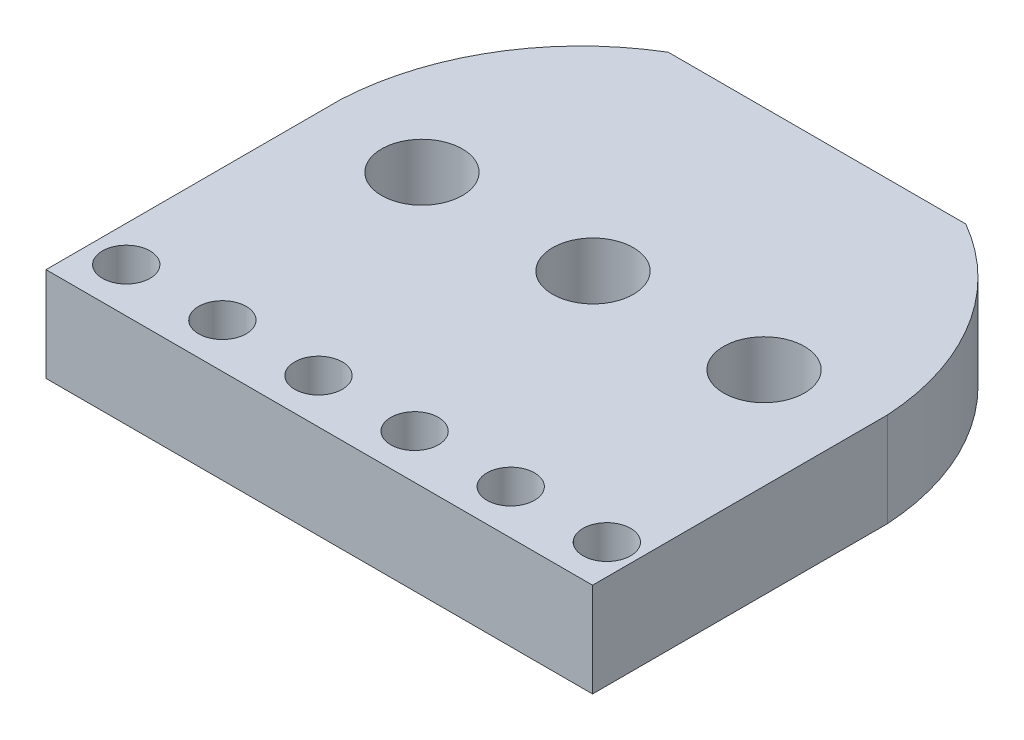
ISO-10303-21;
HEADER;
FILE_DESCRIPTION(('STEP AP214'),'2;1');
FILE_NAME('part.step','',(''),(''),'','','');
FILE_SCHEMA(('AUTOMOTIVE_DESIGN { 1 0 10303 214 1 1 1 1 }'));
ENDSEC;
DATA;
#1=APPLICATION_CONTEXT('core data for automotive mechanical design processes');
#2=APPLICATION_PROTOCOL_DEFINITION('international standard','automotive_design',2000,#1);
#3=PRODUCT_CONTEXT('',#1,'mechanical');
#4=PRODUCT('Part','Part','',(#3));
#5=PRODUCT_RELATED_PRODUCT_CATEGORY('part','',(#4));
#6=PRODUCT_DEFINITION_FORMATION('','',#4);
#7=PRODUCT_DEFINITION_CONTEXT('part definition',#1,'design');
#8=PRODUCT_DEFINITION('design','',#6,#7);
#9=PRODUCT_DEFINITION_SHAPE('','',#8);
#10=(LENGTH_UNIT() NAMED_UNIT(*) SI_UNIT(.MILLI.,.METRE.));
#11=(NAMED_UNIT(*) PLANE_ANGLE_UNIT() SI_UNIT($,.RADIAN.));
#12=(NAMED_UNIT(*) SI_UNIT($,.STERADIAN.) SOLID_ANGLE_UNIT());
#13=UNCERTAINTY_MEASURE_WITH_UNIT(LENGTH_MEASURE(1.E-05),#10,'distance_accuracy_value','');
#14=(GEOMETRIC_REPRESENTATION_CONTEXT(3) GLOBAL_UNCERTAINTY_ASSIGNED_CONTEXT((#13)) GLOBAL_UNIT_ASSIGNED_CONTEXT((#10,
#11,#12)) REPRESENTATION_CONTEXT('',''));
#15=CARTESIAN_POINT('',(0.,0.,0.));
#16=DIRECTION('',(0.,0.,1.));
#17=DIRECTION('',(1.,0.,0.));
#18=AXIS2_PLACEMENT_3D('',#15,#16,#17);
#19=CARTESIAN_POINT('',(5.8,2.,5.3));
#20=DIRECTION('',(-1.,0.,0.));
#21=DIRECTION('',(0.,0.,1.));
#22=AXIS2_PLACEMENT_3D('',#19,#20,#21);
#23=PLANE('',#22);
#24=DIRECTION('',(0.,0.,-1.));
#25=VECTOR('',#24,1.);
#26=CARTESIAN_POINT('',(5.8,0.,5.3));
#27=LINE('',#26,#25);
#28=CARTESIAN_POINT('',(5.8,0.,5.3));
#29=VERTEX_POINT('',#28);
#30=CARTESIAN_POINT('',(5.8,0.,-0.960120866304909));
#31=VERTEX_POINT('',#30);
#32=EDGE_CURVE('E104',#29,#31,#27,.T.);
#33=ORIENTED_EDGE('',*,*,#32,.T.);
#34=DIRECTION('',(0.,1.,0.));
#35=VECTOR('',#34,1.);
#36=CARTESIAN_POINT('',(5.8,0.,-0.960120866304909));
#37=LINE('',#36,#35);
#38=CARTESIAN_POINT('',(5.8,2.,-0.960120866304909));
#39=VERTEX_POINT('',#38);
#40=EDGE_CURVE('E48',#31,#39,#37,.T.);
#41=ORIENTED_EDGE('',*,*,#40,.T.);
#42=DIRECTION('',(0.,0.,-1.));
#43=VECTOR('',#42,1.);
#44=CARTESIAN_POINT('',(5.8,2.,5.3));
#45=LINE('',#44,#43);
#46=CARTESIAN_POINT('',(5.8,2.,5.3));
#47=VERTEX_POINT('',#46);
#48=EDGE_CURVE('E112',#47,#39,#45,.T.);
#49=ORIENTED_EDGE('',*,*,#48,.F.);
#50=DIRECTION('',(0.,-1.,0.));
#51=VECTOR('',#50,1.);
#52=CARTESIAN_POINT('',(5.8,2.,5.3));
#53=LINE('',#52,#51);
#54=EDGE_CURVE('E41',#47,#29,#53,.T.);
#55=ORIENTED_EDGE('',*,*,#54,.T.);
#56=EDGE_LOOP('',(#33,#41,#49,#55));
#57=FACE_BOUND('',#56,.T.);
#58=ADVANCED_FACE('F34',(#57),#23,.F.);
#59=CARTESIAN_POINT('',(-5.8,2.,-5.3));
#60=DIRECTION('',(0.,0.,1.));
#61=DIRECTION('',(1.,0.,0.));
#62=AXIS2_PLACEMENT_3D('',#59,#60,#61);
#63=PLANE('',#62);
#64=DIRECTION('',(-1.,0.,0.));
#65=VECTOR('',#64,1.);
#66=CARTESIAN_POINT('',(-5.8,2.,-5.3));
#67=LINE('',#66,#65);
#68=CARTESIAN_POINT('',(3.12039281549093,2.,-5.3));
#69=VERTEX_POINT('',#68);
#70=CARTESIAN_POINT('',(-3.19151287966167,2.,-5.3));
#71=VERTEX_POINT('',#70);
#72=EDGE_CURVE('E96',#69,#71,#67,.T.);
#73=ORIENTED_EDGE('',*,*,#72,.F.);
#74=DIRECTION('',(0.,1.,0.));
#75=VECTOR('',#74,1.);
#76=CARTESIAN_POINT('',(3.12039281549093,0.,-5.3));
#77=LINE('',#76,#75);
#78=CARTESIAN_POINT('',(3.12039281549093,0.,-5.3));
#79=VERTEX_POINT('',#78);
#80=EDGE_CURVE('E87',#79,#69,#77,.T.);
#81=ORIENTED_EDGE('',*,*,#80,.F.);
#82=DIRECTION('',(-1.,0.,0.));
#83=VECTOR('',#82,1.);
#84=CARTESIAN_POINT('',(-5.8,0.,-5.3));
#85=LINE('',#84,#83);
#86=CARTESIAN_POINT('',(-3.19151287966167,0.,-5.3));
#87=VERTEX_POINT('',#86);
#88=EDGE_CURVE('E56',#79,#87,#85,.T.);
#89=ORIENTED_EDGE('',*,*,#88,.T.);
#90=DIRECTION('',(0.,1.,0.));
#91=VECTOR('',#90,1.);
#92=CARTESIAN_POINT('',(-3.19151287966167,0.,-5.3));
#93=LINE('',#92,#91);
#94=EDGE_CURVE('E126',#87,#71,#93,.T.);
#95=ORIENTED_EDGE('',*,*,#94,.T.);
#96=EDGE_LOOP('',(#73,#81,#89,#95));
#97=FACE_BOUND('',#96,.T.);
#98=ADVANCED_FACE('F95',(#97),#63,.F.);
#99=CARTESIAN_POINT('',(-5.8,2.,5.3));
#100=DIRECTION('',(1.,0.,0.));
#101=DIRECTION('',(0.,0.,-1.));
#102=AXIS2_PLACEMENT_3D('',#99,#100,#101);
#103=PLANE('',#102);
#104=DIRECTION('',(0.,0.,1.));
#105=VECTOR('',#104,1.);
#106=CARTESIAN_POINT('',(-5.8,2.,5.3));
#107=LINE('',#106,#105);
#108=CARTESIAN_POINT('',(-5.8,2.,-0.960120866304909));
#109=VERTEX_POINT('',#108);
#110=CARTESIAN_POINT('',(-5.8,2.,5.3));
#111=VERTEX_POINT('',#110);
#112=EDGE_CURVE('E118',#109,#111,#107,.T.);
#113=ORIENTED_EDGE('',*,*,#112,.F.);
#114=DIRECTION('',(0.,1.,0.));
#115=VECTOR('',#114,1.);
#116=CARTESIAN_POINT('',(-5.8,0.,-0.960120866304909));
#117=LINE('',#116,#115);
#118=CARTESIAN_POINT('',(-5.8,0.,-0.960120866304909));
#119=VERTEX_POINT('',#118);
#120=EDGE_CURVE('E108',#119,#109,#117,.T.);
#121=ORIENTED_EDGE('',*,*,#120,.F.);
#122=DIRECTION('',(0.,0.,1.));
#123=VECTOR('',#122,1.);
#124=CARTESIAN_POINT('',(-5.8,0.,5.3));
#125=LINE('',#124,#123);
#126=CARTESIAN_POINT('',(-5.8,0.,5.3));
#127=VERTEX_POINT('',#126);
#128=EDGE_CURVE('E103',#119,#127,#125,.T.);
#129=ORIENTED_EDGE('',*,*,#128,.T.);
#130=DIRECTION('',(0.,-1.,0.));
#131=VECTOR('',#130,1.);
#132=CARTESIAN_POINT('',(-5.8,2.,5.3));
#133=LINE('',#132,#131);
#134=EDGE_CURVE('E11',#111,#127,#133,.T.);
#135=ORIENTED_EDGE('',*,*,#134,.F.);
#136=EDGE_LOOP('',(#113,#121,#129,#135));
#137=FACE_BOUND('',#136,.T.);
#138=ADVANCED_FACE('F223',(#137),#103,.F.);
#139=CARTESIAN_POINT('',(-5.8,2.,5.3));
#140=DIRECTION('',(0.,0.,-1.));
#141=DIRECTION('',(-1.,0.,0.));
#142=AXIS2_PLACEMENT_3D('',#139,#140,#141);
#143=PLANE('',#142);
#144=DIRECTION('',(1.,0.,0.));
#145=VECTOR('',#144,1.);
#146=CARTESIAN_POINT('',(-5.8,0.,5.3));
#147=LINE('',#146,#145);
#148=EDGE_CURVE('E106',#127,#29,#147,.T.);
#149=ORIENTED_EDGE('',*,*,#148,.T.);
#150=ORIENTED_EDGE('',*,*,#54,.F.);
#151=DIRECTION('',(1.,0.,0.));
#152=VECTOR('',#151,1.);
#153=CARTESIAN_POINT('',(-5.8,2.,5.3));
#154=LINE('',#153,#152);
#155=EDGE_CURVE('E114',#111,#47,#154,.T.);
#156=ORIENTED_EDGE('',*,*,#155,.F.);
#157=ORIENTED_EDGE('',*,*,#134,.T.);
#158=EDGE_LOOP('',(#149,#150,#156,#157));
#159=FACE_BOUND('',#158,.T.);
#160=ADVANCED_FACE('F201',(#159),#143,.F.);
#161=CARTESIAN_POINT('',(0.,2.,0.));
#162=DIRECTION('',(0.,-1.,0.));
#163=DIRECTION('',(0.,0.,-1.));
#164=AXIS2_PLACEMENT_3D('',#161,#162,#163);
#165=PLANE('',#164);
#166=CARTESIAN_POINT('',(5.15936545189926,2.,4.35610393045742));
#167=DIRECTION('',(0.,1.,0.));
#168=DIRECTION('',(0.,0.,1.));
#169=AXIS2_PLACEMENT_3D('',#166,#167,#168);
#170=CIRCLE('',#169,0.505403015569049);
#171=CARTESIAN_POINT('',(5.15936545189926,2.,4.86150694602647));
#172=VERTEX_POINT('',#171);
#173=EDGE_CURVE('E183',#172,#172,#170,.T.);
#174=ORIENTED_EDGE('',*,*,#173,.F.);
#175=EDGE_LOOP('',(#174));
#176=FACE_BOUND('',#175,.T.);
#177=CARTESIAN_POINT('',(3.11936545189926,2.,4.35610393045742));
#178=DIRECTION('',(0.,1.,0.));
#179=DIRECTION('',(0.,0.,1.));
#180=AXIS2_PLACEMENT_3D('',#177,#178,#179);
#181=CIRCLE('',#180,0.505403015569049);
#182=CARTESIAN_POINT('',(3.11936545189926,2.,4.86150694602647));
#183=VERTEX_POINT('',#182);
#184=EDGE_CURVE('E177',#183,#183,#181,.T.);
#185=ORIENTED_EDGE('',*,*,#184,.F.);
#186=EDGE_LOOP('',(#185));
#187=FACE_BOUND('',#186,.T.);
#188=CARTESIAN_POINT('',(1.07936545189926,2.,4.35610393045742));
#189=DIRECTION('',(0.,1.,0.));
#190=DIRECTION('',(0.,0.,1.));
#191=AXIS2_PLACEMENT_3D('',#188,#189,#190);
#192=CIRCLE('',#191,0.505403015569049);
#193=CARTESIAN_POINT('',(1.07936545189926,2.,4.86150694602647));
#194=VERTEX_POINT('',#193);
#195=EDGE_CURVE('E171',#194,#194,#192,.T.);
#196=ORIENTED_EDGE('',*,*,#195,.F.);
#197=EDGE_LOOP('',(#196));
#198=FACE_BOUND('',#197,.T.);
#199=CARTESIAN_POINT('',(-0.960634548100744,2.,4.35610393045742));
#200=DIRECTION('',(0.,1.,0.));
#201=DIRECTION('',(0.,0.,1.));
#202=AXIS2_PLACEMENT_3D('',#199,#200,#201);
#203=CIRCLE('',#202,0.505403015569049);
#204=CARTESIAN_POINT('',(-0.960634548100744,2.,4.86150694602647));
#205=VERTEX_POINT('',#204);
#206=EDGE_CURVE('E165',#205,#205,#203,.T.);
#207=ORIENTED_EDGE('',*,*,#206,.F.);
#208=EDGE_LOOP('',(#207));
#209=FACE_BOUND('',#208,.T.);
#210=CARTESIAN_POINT('',(-3.00063454810074,2.,4.35610393045742));
#211=DIRECTION('',(0.,1.,0.));
#212=DIRECTION('',(0.,0.,1.));
#213=AXIS2_PLACEMENT_3D('',#210,#211,#212);
#214=CIRCLE('',#213,0.505403015569049);
#215=CARTESIAN_POINT('',(-3.00063454810074,2.,4.86150694602647));
#216=VERTEX_POINT('',#215);
#217=EDGE_CURVE('E159',#216,#216,#214,.T.);
#218=ORIENTED_EDGE('',*,*,#217,.F.);
#219=EDGE_LOOP('',(#218));
#220=FACE_BOUND('',#219,.T.);
#221=CARTESIAN_POINT('',(-5.04063454810074,2.,4.35610393045742));
#222=DIRECTION('',(0.,1.,0.));
#223=DIRECTION('',(0.,0.,1.));
#224=AXIS2_PLACEMENT_3D('',#221,#222,#223);
#225=CIRCLE('',#224,0.505403015569049);
#226=CARTESIAN_POINT('',(-5.04063454810074,2.,4.86150694602647));
#227=VERTEX_POINT('',#226);
#228=EDGE_CURVE('E153',#227,#227,#225,.T.);
#229=ORIENTED_EDGE('',*,*,#228,.F.);
#230=EDGE_LOOP('',(#229));
#231=FACE_BOUND('',#230,.T.);
#232=CARTESIAN_POINT('',(3.65954675135661,2.,-0.480060433152458));
#233=DIRECTION('',(0.,1.,0.));
#234=DIRECTION('',(0.,0.,1.));
#235=AXIS2_PLACEMENT_3D('',#232,#233,#234);
#236=CIRCLE('',#235,0.858058489989727);
#237=CARTESIAN_POINT('',(3.65954675135661,2.,0.37799805683727));
#238=VERTEX_POINT('',#237);
#239=EDGE_CURVE('E147',#238,#238,#236,.T.);
#240=ORIENTED_EDGE('',*,*,#239,.F.);
#241=EDGE_LOOP('',(#240));
#242=FACE_BOUND('',#241,.T.);
#243=CARTESIAN_POINT('',(0.0295467513566111,2.,-0.480060433152458));
#244=DIRECTION('',(0.,1.,0.));
#245=DIRECTION('',(0.,0.,1.));
#246=AXIS2_PLACEMENT_3D('',#243,#244,#245);
#247=CIRCLE('',#246,0.858058489989727);
#248=CARTESIAN_POINT('',(0.0295467513566111,2.,0.37799805683727));
#249=VERTEX_POINT('',#248);
#250=EDGE_CURVE('E141',#249,#249,#247,.T.);
#251=ORIENTED_EDGE('',*,*,#250,.F.);
#252=EDGE_LOOP('',(#251));
#253=FACE_BOUND('',#252,.T.);
#254=CARTESIAN_POINT('',(-3.60045324864339,2.,-0.480060433152458));
#255=DIRECTION('',(0.,1.,0.));
#256=DIRECTION('',(0.,0.,1.));
#257=AXIS2_PLACEMENT_3D('',#254,#255,#256);
#258=CIRCLE('',#257,0.858058489989727);
#259=CARTESIAN_POINT('',(-3.60045324864339,2.,0.37799805683727));
#260=VERTEX_POINT('',#259);
#261=EDGE_CURVE('E135',#260,#260,#258,.T.);
#262=ORIENTED_EDGE('',*,*,#261,.F.);
#263=EDGE_LOOP('',(#262));
#264=FACE_BOUND('',#263,.T.);
#265=ORIENTED_EDGE('',*,*,#48,.T.);
#266=CARTESIAN_POINT('',(0.439500257204962,2.,-0.647529016996838));
#267=DIRECTION('',(0.,-1.,0.));
#268=DIRECTION('',(0.,0.,-1.));
#269=AXIS2_PLACEMENT_3D('',#266,#267,#268);
#270=CIRCLE('',#269,5.36960623852061);
#271=EDGE_CURVE('E92',#69,#39,#270,.T.);
#272=ORIENTED_EDGE('',*,*,#271,.F.);
#273=ORIENTED_EDGE('',*,*,#72,.T.);
#274=CARTESIAN_POINT('',(-0.437160224322583,2.,-0.690638590131382));
#275=DIRECTION('',(0.,-1.,0.));
#276=DIRECTION('',(0.,0.,-1.));
#277=AXIS2_PLACEMENT_3D('',#274,#275,#276);
#278=CIRCLE('',#277,5.36960623852061);
#279=EDGE_CURVE('E97',#109,#71,#278,.T.);
#280=ORIENTED_EDGE('',*,*,#279,.F.);
#281=ORIENTED_EDGE('',*,*,#112,.T.);
#282=ORIENTED_EDGE('',*,*,#155,.T.);
#283=EDGE_LOOP('',(#265,#272,#273,#280,#281,#282));
#284=FACE_BOUND('',#283,.T.);
#285=ADVANCED_FACE('F198',(#176,#187,#198,#209,#220,#231,#242,#253,#264,#284),#165,.F.);
#286=CARTESIAN_POINT('',(0.,0.,0.));
#287=DIRECTION('',(0.,-1.,0.));
#288=DIRECTION('',(0.,0.,-1.));
#289=AXIS2_PLACEMENT_3D('',#286,#287,#288);
#290=PLANE('',#289);
#291=CARTESIAN_POINT('',(5.15936545189926,0.,4.35610393045742));
#292=DIRECTION('',(0.,1.,0.));
#293=DIRECTION('',(0.,0.,1.));
#294=AXIS2_PLACEMENT_3D('',#291,#292,#293);
#295=CIRCLE('',#294,0.505403015569049);
#296=CARTESIAN_POINT('',(5.15936545189926,0.,4.86150694602647));
#297=VERTEX_POINT('',#296);
#298=EDGE_CURVE('E180',#297,#297,#295,.T.);
#299=ORIENTED_EDGE('',*,*,#298,.T.);
#300=EDGE_LOOP('',(#299));
#301=FACE_BOUND('',#300,.T.);
#302=CARTESIAN_POINT('',(3.11936545189926,0.,4.35610393045742));
#303=DIRECTION('',(0.,1.,0.));
#304=DIRECTION('',(0.,0.,1.));
#305=AXIS2_PLACEMENT_3D('',#302,#303,#304);
#306=CIRCLE('',#305,0.505403015569049);
#307=CARTESIAN_POINT('',(3.11936545189926,0.,4.86150694602647));
#308=VERTEX_POINT('',#307);
#309=EDGE_CURVE('E174',#308,#308,#306,.T.);
#310=ORIENTED_EDGE('',*,*,#309,.T.);
#311=EDGE_LOOP('',(#310));
#312=FACE_BOUND('',#311,.T.);
#313=CARTESIAN_POINT('',(1.07936545189926,0.,4.35610393045742));
#314=DIRECTION('',(0.,1.,0.));
#315=DIRECTION('',(0.,0.,1.));
#316=AXIS2_PLACEMENT_3D('',#313,#314,#315);
#317=CIRCLE('',#316,0.505403015569049);
#318=CARTESIAN_POINT('',(1.07936545189926,0.,4.86150694602647));
#319=VERTEX_POINT('',#318);
#320=EDGE_CURVE('E168',#319,#319,#317,.T.);
#321=ORIENTED_EDGE('',*,*,#320,.T.);
#322=EDGE_LOOP('',(#321));
#323=FACE_BOUND('',#322,.T.);
#324=CARTESIAN_POINT('',(-0.960634548100744,0.,4.35610393045742));
#325=DIRECTION('',(0.,1.,0.));
#326=DIRECTION('',(0.,0.,1.));
#327=AXIS2_PLACEMENT_3D('',#324,#325,#326);
#328=CIRCLE('',#327,0.505403015569049);
#329=CARTESIAN_POINT('',(-0.960634548100744,0.,4.86150694602647));
#330=VERTEX_POINT('',#329);
#331=EDGE_CURVE('E162',#330,#330,#328,.T.);
#332=ORIENTED_EDGE('',*,*,#331,.T.);
#333=EDGE_LOOP('',(#332));
#334=FACE_BOUND('',#333,.T.);
#335=CARTESIAN_POINT('',(-3.00063454810074,0.,4.35610393045742));
#336=DIRECTION('',(0.,1.,0.));
#337=DIRECTION('',(0.,0.,1.));
#338=AXIS2_PLACEMENT_3D('',#335,#336,#337);
#339=CIRCLE('',#338,0.505403015569049);
#340=CARTESIAN_POINT('',(-3.00063454810074,0.,4.86150694602647));
#341=VERTEX_POINT('',#340);
#342=EDGE_CURVE('E156',#341,#341,#339,.T.);
#343=ORIENTED_EDGE('',*,*,#342,.T.);
#344=EDGE_LOOP('',(#343));
#345=FACE_BOUND('',#344,.T.);
#346=CARTESIAN_POINT('',(-5.04063454810074,0.,4.35610393045742));
#347=DIRECTION('',(0.,1.,0.));
#348=DIRECTION('',(0.,0.,1.));
#349=AXIS2_PLACEMENT_3D('',#346,#347,#348);
#350=CIRCLE('',#349,0.505403015569049);
#351=CARTESIAN_POINT('',(-5.04063454810074,0.,4.86150694602647));
#352=VERTEX_POINT('',#351);
#353=EDGE_CURVE('E150',#352,#352,#350,.T.);
#354=ORIENTED_EDGE('',*,*,#353,.T.);
#355=EDGE_LOOP('',(#354));
#356=FACE_BOUND('',#355,.T.);
#357=CARTESIAN_POINT('',(3.65954675135661,0.,-0.480060433152458));
#358=DIRECTION('',(0.,1.,0.));
#359=DIRECTION('',(0.,0.,1.));
#360=AXIS2_PLACEMENT_3D('',#357,#358,#359);
#361=CIRCLE('',#360,0.858058489989727);
#362=CARTESIAN_POINT('',(3.65954675135661,0.,0.37799805683727));
#363=VERTEX_POINT('',#362);
#364=EDGE_CURVE('E144',#363,#363,#361,.T.);
#365=ORIENTED_EDGE('',*,*,#364,.T.);
#366=EDGE_LOOP('',(#365));
#367=FACE_BOUND('',#366,.T.);
#368=CARTESIAN_POINT('',(0.0295467513566111,0.,-0.480060433152458));
#369=DIRECTION('',(0.,1.,0.));
#370=DIRECTION('',(0.,0.,1.));
#371=AXIS2_PLACEMENT_3D('',#368,#369,#370);
#372=CIRCLE('',#371,0.858058489989727);
#373=CARTESIAN_POINT('',(0.0295467513566111,0.,0.37799805683727));
#374=VERTEX_POINT('',#373);
#375=EDGE_CURVE('E138',#374,#374,#372,.T.);
#376=ORIENTED_EDGE('',*,*,#375,.T.);
#377=EDGE_LOOP('',(#376));
#378=FACE_BOUND('',#377,.T.);
#379=CARTESIAN_POINT('',(-3.60045324864339,0.,-0.480060433152458));
#380=DIRECTION('',(0.,1.,0.));
#381=DIRECTION('',(0.,0.,1.));
#382=AXIS2_PLACEMENT_3D('',#379,#380,#381);
#383=CIRCLE('',#382,0.858058489989727);
#384=CARTESIAN_POINT('',(-3.60045324864339,0.,0.37799805683727));
#385=VERTEX_POINT('',#384);
#386=EDGE_CURVE('E133',#385,#385,#383,.T.);
#387=ORIENTED_EDGE('',*,*,#386,.T.);
#388=EDGE_LOOP('',(#387));
#389=FACE_BOUND('',#388,.T.);
#390=CARTESIAN_POINT('',(0.439500257204962,0.,-0.647529016996838));
#391=DIRECTION('',(0.,-1.,0.));
#392=DIRECTION('',(0.,0.,-1.));
#393=AXIS2_PLACEMENT_3D('',#390,#391,#392);
#394=CIRCLE('',#393,5.36960623852061);
#395=EDGE_CURVE('E85',#79,#31,#394,.T.);
#396=ORIENTED_EDGE('',*,*,#395,.T.);
#397=ORIENTED_EDGE('',*,*,#32,.F.);
#398=ORIENTED_EDGE('',*,*,#148,.F.);
#399=ORIENTED_EDGE('',*,*,#128,.F.);
#400=CARTESIAN_POINT('',(-0.437160224322583,0.,-0.690638590131382));
#401=DIRECTION('',(0.,-1.,0.));
#402=DIRECTION('',(0.,0.,-1.));
#403=AXIS2_PLACEMENT_3D('',#400,#401,#402);
#404=CIRCLE('',#403,5.36960623852061);
#405=EDGE_CURVE('E102',#119,#87,#404,.T.);
#406=ORIENTED_EDGE('',*,*,#405,.T.);
#407=ORIENTED_EDGE('',*,*,#88,.F.);
#408=EDGE_LOOP('',(#396,#397,#398,#399,#406,#407));
#409=FACE_BOUND('',#408,.T.);
#410=ADVANCED_FACE('F100',(#301,#312,#323,#334,#345,#356,#367,#378,#389,#409),#290,.T.);
#411=CARTESIAN_POINT('',(-0.437160224322583,0.,-0.690638590131382));
#412=DIRECTION('',(0.,1.,0.));
#413=DIRECTION('',(0.,0.,1.));
#414=AXIS2_PLACEMENT_3D('',#411,#412,#413);
#415=CYLINDRICAL_SURFACE('',#414,5.36960623852061);
#416=ORIENTED_EDGE('',*,*,#279,.T.);
#417=ORIENTED_EDGE('',*,*,#94,.F.);
#418=ORIENTED_EDGE('',*,*,#405,.F.);
#419=ORIENTED_EDGE('',*,*,#120,.T.);
#420=EDGE_LOOP('',(#416,#417,#418,#419));
#421=FACE_BOUND('',#420,.T.);
#422=ADVANCED_FACE('F227',(#421),#415,.T.);
#423=CARTESIAN_POINT('',(0.439500257204962,0.,-0.647529016996838));
#424=DIRECTION('',(0.,1.,0.));
#425=DIRECTION('',(0.,0.,1.));
#426=AXIS2_PLACEMENT_3D('',#423,#424,#425);
#427=CYLINDRICAL_SURFACE('',#426,5.36960623852061);
#428=ORIENTED_EDGE('',*,*,#271,.T.);
#429=ORIENTED_EDGE('',*,*,#40,.F.);
#430=ORIENTED_EDGE('',*,*,#395,.F.);
#431=ORIENTED_EDGE('',*,*,#80,.T.);
#432=EDGE_LOOP('',(#428,#429,#430,#431));
#433=FACE_BOUND('',#432,.T.);
#434=ADVANCED_FACE('F86',(#433),#427,.T.);
#435=CARTESIAN_POINT('',(-3.60045324864339,0.,-0.480060433152458));
#436=DIRECTION('',(0.,1.,0.));
#437=DIRECTION('',(0.,0.,1.));
#438=AXIS2_PLACEMENT_3D('',#435,#436,#437);
#439=CYLINDRICAL_SURFACE('',#438,0.858058489989727);
#440=ORIENTED_EDGE('',*,*,#386,.F.);
#441=EDGE_LOOP('',(#440));
#442=FACE_BOUND('',#441,.T.);
#443=ORIENTED_EDGE('',*,*,#261,.T.);
#444=EDGE_LOOP('',(#443));
#445=FACE_BOUND('',#444,.T.);
#446=ADVANCED_FACE('F234',(#442,#445),#439,.F.);
#447=CARTESIAN_POINT('',(0.0295467513566111,0.,-0.480060433152458));
#448=DIRECTION('',(0.,1.,0.));
#449=DIRECTION('',(0.,0.,1.));
#450=AXIS2_PLACEMENT_3D('',#447,#448,#449);
#451=CYLINDRICAL_SURFACE('',#450,0.858058489989727);
#452=ORIENTED_EDGE('',*,*,#375,.F.);
#453=EDGE_LOOP('',(#452));
#454=FACE_BOUND('',#453,.T.);
#455=ORIENTED_EDGE('',*,*,#250,.T.);
#456=EDGE_LOOP('',(#455));
#457=FACE_BOUND('',#456,.T.);
#458=ADVANCED_FACE('F278',(#454,#457),#451,.F.);
#459=CARTESIAN_POINT('',(3.65954675135661,0.,-0.480060433152458));
#460=DIRECTION('',(0.,1.,0.));
#461=DIRECTION('',(0.,0.,1.));
#462=AXIS2_PLACEMENT_3D('',#459,#460,#461);
#463=CYLINDRICAL_SURFACE('',#462,0.858058489989727);
#464=ORIENTED_EDGE('',*,*,#364,.F.);
#465=EDGE_LOOP('',(#464));
#466=FACE_BOUND('',#465,.T.);
#467=ORIENTED_EDGE('',*,*,#239,.T.);
#468=EDGE_LOOP('',(#467));
#469=FACE_BOUND('',#468,.T.);
#470=ADVANCED_FACE('F288',(#466,#469),#463,.F.);
#471=CARTESIAN_POINT('',(-5.04063454810074,0.,4.35610393045742));
#472=DIRECTION('',(0.,1.,0.));
#473=DIRECTION('',(0.,0.,1.));
#474=AXIS2_PLACEMENT_3D('',#471,#472,#473);
#475=CYLINDRICAL_SURFACE('',#474,0.505403015569049);
#476=ORIENTED_EDGE('',*,*,#353,.F.);
#477=EDGE_LOOP('',(#476));
#478=FACE_BOUND('',#477,.T.);
#479=ORIENTED_EDGE('',*,*,#228,.T.);
#480=EDGE_LOOP('',(#479));
#481=FACE_BOUND('',#480,.T.);
#482=ADVANCED_FACE('F298',(#478,#481),#475,.F.);
#483=CARTESIAN_POINT('',(-3.00063454810074,0.,4.35610393045742));
#484=DIRECTION('',(0.,1.,0.));
#485=DIRECTION('',(0.,0.,1.));
#486=AXIS2_PLACEMENT_3D('',#483,#484,#485);
#487=CYLINDRICAL_SURFACE('',#486,0.505403015569049);
#488=ORIENTED_EDGE('',*,*,#342,.F.);
#489=EDGE_LOOP('',(#488));
#490=FACE_BOUND('',#489,.T.);
#491=ORIENTED_EDGE('',*,*,#217,.T.);
#492=EDGE_LOOP('',(#491));
#493=FACE_BOUND('',#492,.T.);
#494=ADVANCED_FACE('F308',(#490,#493),#487,.F.);
#495=CARTESIAN_POINT('',(-0.960634548100744,0.,4.35610393045742));
#496=DIRECTION('',(0.,1.,0.));
#497=DIRECTION('',(0.,0.,1.));
#498=AXIS2_PLACEMENT_3D('',#495,#496,#497);
#499=CYLINDRICAL_SURFACE('',#498,0.505403015569049);
#500=ORIENTED_EDGE('',*,*,#331,.F.);
#501=EDGE_LOOP('',(#500));
#502=FACE_BOUND('',#501,.T.);
#503=ORIENTED_EDGE('',*,*,#206,.T.);
#504=EDGE_LOOP('',(#503));
#505=FACE_BOUND('',#504,.T.);
#506=ADVANCED_FACE('F318',(#502,#505),#499,.F.);
#507=CARTESIAN_POINT('',(1.07936545189926,0.,4.35610393045742));
#508=DIRECTION('',(0.,1.,0.));
#509=DIRECTION('',(0.,0.,1.));
#510=AXIS2_PLACEMENT_3D('',#507,#508,#509);
#511=CYLINDRICAL_SURFACE('',#510,0.505403015569049);
#512=ORIENTED_EDGE('',*,*,#320,.F.);
#513=EDGE_LOOP('',(#512));
#514=FACE_BOUND('',#513,.T.);
#515=ORIENTED_EDGE('',*,*,#195,.T.);
#516=EDGE_LOOP('',(#515));
#517=FACE_BOUND('',#516,.T.);
#518=ADVANCED_FACE('F328',(#514,#517),#511,.F.);
#519=CARTESIAN_POINT('',(3.11936545189926,0.,4.35610393045742));
#520=DIRECTION('',(0.,1.,0.));
#521=DIRECTION('',(0.,0.,1.));
#522=AXIS2_PLACEMENT_3D('',#519,#520,#521);
#523=CYLINDRICAL_SURFACE('',#522,0.505403015569049);
#524=ORIENTED_EDGE('',*,*,#309,.F.);
#525=EDGE_LOOP('',(#524));
#526=FACE_BOUND('',#525,.T.);
#527=ORIENTED_EDGE('',*,*,#184,.T.);
#528=EDGE_LOOP('',(#527));
#529=FACE_BOUND('',#528,.T.);
#530=ADVANCED_FACE('F194',(#526,#529),#523,.F.);
#531=CARTESIAN_POINT('',(5.15936545189926,0.,4.35610393045742));
#532=DIRECTION('',(0.,1.,0.));
#533=DIRECTION('',(0.,0.,1.));
#534=AXIS2_PLACEMENT_3D('',#531,#532,#533);
#535=CYLINDRICAL_SURFACE('',#534,0.505403015569049);
#536=ORIENTED_EDGE('',*,*,#298,.F.);
#537=EDGE_LOOP('',(#536));
#538=FACE_BOUND('',#537,.T.);
#539=ORIENTED_EDGE('',*,*,#173,.T.);
#540=EDGE_LOOP('',(#539));
#541=FACE_BOUND('',#540,.T.);
#542=ADVANCED_FACE('F191',(#538,#541),#535,.F.);
#543=CLOSED_SHELL('',(#58,#98,#138,#160,#285,#410,#422,#434,#446,#458,#470,#482,#494,#506,#518,
#530,#542));
#544=MANIFOLD_SOLID_BREP('B2',#543);
#545=ADVANCED_BREP_SHAPE_REPRESENTATION('',(#18,#544),#14);
#546=SHAPE_DEFINITION_REPRESENTATION(#9,#545);
ENDSEC;
END-ISO-10303-21;
